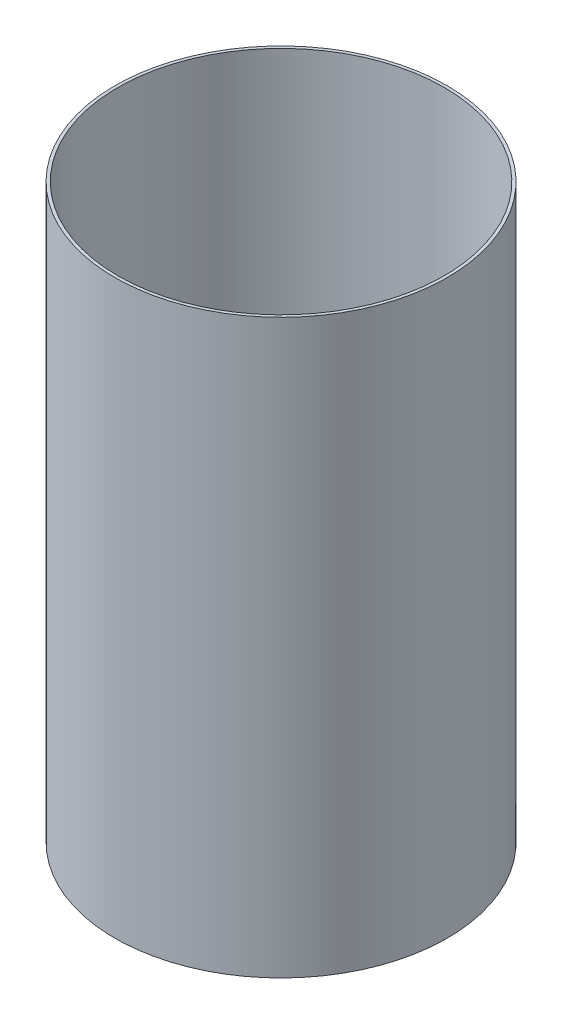
ISO-10303-21;
HEADER;
FILE_DESCRIPTION(('STEP AP214'),'2;1');
FILE_NAME('part.step','',(''),(''),'','','');
FILE_SCHEMA(('AUTOMOTIVE_DESIGN { 1 0 10303 214 1 1 1 1 }'));
ENDSEC;
DATA;
#1=APPLICATION_CONTEXT('core data for automotive mechanical design processes');
#2=APPLICATION_PROTOCOL_DEFINITION('international standard','automotive_design',2000,#1);
#3=PRODUCT_CONTEXT('',#1,'mechanical');
#4=PRODUCT('Part','Part','',(#3));
#5=PRODUCT_RELATED_PRODUCT_CATEGORY('part','',(#4));
#6=PRODUCT_DEFINITION_FORMATION('','',#4);
#7=PRODUCT_DEFINITION_CONTEXT('part definition',#1,'design');
#8=PRODUCT_DEFINITION('design','',#6,#7);
#9=PRODUCT_DEFINITION_SHAPE('','',#8);
#10=(LENGTH_UNIT() NAMED_UNIT(*) SI_UNIT(.MILLI.,.METRE.));
#11=(NAMED_UNIT(*) PLANE_ANGLE_UNIT() SI_UNIT($,.RADIAN.));
#12=(NAMED_UNIT(*) SI_UNIT($,.STERADIAN.) SOLID_ANGLE_UNIT());
#13=UNCERTAINTY_MEASURE_WITH_UNIT(LENGTH_MEASURE(1.E-05),#10,'distance_accuracy_value','');
#14=(GEOMETRIC_REPRESENTATION_CONTEXT(3) GLOBAL_UNCERTAINTY_ASSIGNED_CONTEXT((#13)) GLOBAL_UNIT_ASSIGNED_CONTEXT((#10,
#11,#12)) REPRESENTATION_CONTEXT('',''));
#15=CARTESIAN_POINT('',(0.,0.,0.));
#16=DIRECTION('',(0.,0.,1.));
#17=DIRECTION('',(1.,0.,0.));
#18=AXIS2_PLACEMENT_3D('',#15,#16,#17);
#19=CARTESIAN_POINT('',(0.,304.8,0.));
#20=DIRECTION('',(0.,1.,0.));
#21=DIRECTION('',(0.,0.,1.));
#22=AXIS2_PLACEMENT_3D('',#19,#20,#21);
#23=PLANE('',#22);
#24=CARTESIAN_POINT('',(0.,304.8,0.));
#25=DIRECTION('',(0.,1.,0.));
#26=DIRECTION('',(0.,0.,1.));
#27=AXIS2_PLACEMENT_3D('',#24,#25,#26);
#28=CIRCLE('',#27,88.519);
#29=CARTESIAN_POINT('',(0.,304.8,-88.519));
#30=VERTEX_POINT('',#29);
#31=EDGE_CURVE('E10',#30,#30,#28,.T.);
#32=ORIENTED_EDGE('',*,*,#31,.T.);
#33=EDGE_LOOP('',(#32));
#34=FACE_BOUND('',#33,.T.);
#35=CARTESIAN_POINT('',(0.,304.8,0.));
#36=DIRECTION('',(0.,1.,0.));
#37=DIRECTION('',(0.,0.,1.));
#38=AXIS2_PLACEMENT_3D('',#35,#36,#37);
#39=CIRCLE('',#38,86.9315);
#40=CARTESIAN_POINT('',(0.,304.8,-86.9315));
#41=VERTEX_POINT('',#40);
#42=EDGE_CURVE('E56',#41,#41,#39,.T.);
#43=ORIENTED_EDGE('',*,*,#42,.F.);
#44=EDGE_LOOP('',(#43));
#45=FACE_BOUND('',#44,.T.);
#46=ADVANCED_FACE('F43',(#34,#45),#23,.T.);
#47=CARTESIAN_POINT('',(0.,0.,0.));
#48=DIRECTION('',(0.,1.,0.));
#49=DIRECTION('',(0.,0.,1.));
#50=AXIS2_PLACEMENT_3D('',#47,#48,#49);
#51=PLANE('',#50);
#52=CARTESIAN_POINT('',(0.,0.,0.));
#53=DIRECTION('',(0.,1.,0.));
#54=DIRECTION('',(0.,0.,1.));
#55=AXIS2_PLACEMENT_3D('',#52,#53,#54);
#56=CIRCLE('',#55,88.519);
#57=CARTESIAN_POINT('',(0.,0.,-88.519));
#58=VERTEX_POINT('',#57);
#59=EDGE_CURVE('E47',#58,#58,#56,.T.);
#60=ORIENTED_EDGE('',*,*,#59,.F.);
#61=EDGE_LOOP('',(#60));
#62=FACE_BOUND('',#61,.T.);
#63=CARTESIAN_POINT('',(0.,0.,0.));
#64=DIRECTION('',(0.,1.,0.));
#65=DIRECTION('',(0.,0.,1.));
#66=AXIS2_PLACEMENT_3D('',#63,#64,#65);
#67=CIRCLE('',#66,86.9315);
#68=CARTESIAN_POINT('',(0.,0.,-86.9315));
#69=VERTEX_POINT('',#68);
#70=EDGE_CURVE('E58',#69,#69,#67,.T.);
#71=ORIENTED_EDGE('',*,*,#70,.T.);
#72=EDGE_LOOP('',(#71));
#73=FACE_BOUND('',#72,.T.);
#74=ADVANCED_FACE('F70',(#62,#73),#51,.F.);
#75=CARTESIAN_POINT('',(0.,304.8,0.));
#76=DIRECTION('',(0.,-1.,0.));
#77=DIRECTION('',(0.,0.,-1.));
#78=AXIS2_PLACEMENT_3D('',#75,#76,#77);
#79=CYLINDRICAL_SURFACE('',#78,88.519);
#80=CARTESIAN_POINT('',(0.,304.8,-88.519));
#81=CARTESIAN_POINT('',(0.,301.625,-88.519));
#82=CARTESIAN_POINT('',(0.,298.45,-88.519));
#83=CARTESIAN_POINT('',(0.,292.1,-88.519));
#84=CARTESIAN_POINT('',(0.,288.925,-88.519));
#85=CARTESIAN_POINT('',(0.,282.575,-88.519));
#86=CARTESIAN_POINT('',(0.,279.4,-88.519));
#87=CARTESIAN_POINT('',(0.,273.05,-88.519));
#88=CARTESIAN_POINT('',(0.,269.875,-88.519));
#89=CARTESIAN_POINT('',(0.,263.525,-88.519));
#90=CARTESIAN_POINT('',(0.,260.35,-88.519));
#91=CARTESIAN_POINT('',(0.,254.,-88.519));
#92=CARTESIAN_POINT('',(0.,250.825,-88.519));
#93=CARTESIAN_POINT('',(0.,244.475,-88.519));
#94=CARTESIAN_POINT('',(0.,241.3,-88.519));
#95=CARTESIAN_POINT('',(0.,234.95,-88.519));
#96=CARTESIAN_POINT('',(0.,231.775,-88.519));
#97=CARTESIAN_POINT('',(0.,225.425,-88.519));
#98=CARTESIAN_POINT('',(0.,222.25,-88.519));
#99=CARTESIAN_POINT('',(0.,215.9,-88.519));
#100=CARTESIAN_POINT('',(0.,212.725,-88.519));
#101=CARTESIAN_POINT('',(0.,206.375,-88.519));
#102=CARTESIAN_POINT('',(0.,203.2,-88.519));
#103=CARTESIAN_POINT('',(0.,196.85,-88.519));
#104=CARTESIAN_POINT('',(0.,193.675,-88.519));
#105=CARTESIAN_POINT('',(0.,187.325,-88.519));
#106=CARTESIAN_POINT('',(0.,184.15,-88.519));
#107=CARTESIAN_POINT('',(0.,177.8,-88.519));
#108=CARTESIAN_POINT('',(0.,174.625,-88.519));
#109=CARTESIAN_POINT('',(0.,168.275,-88.519));
#110=CARTESIAN_POINT('',(0.,165.1,-88.519));
#111=CARTESIAN_POINT('',(0.,158.75,-88.519));
#112=CARTESIAN_POINT('',(0.,155.575,-88.519));
#113=CARTESIAN_POINT('',(0.,149.225,-88.519));
#114=CARTESIAN_POINT('',(0.,146.05,-88.519));
#115=CARTESIAN_POINT('',(0.,139.7,-88.519));
#116=CARTESIAN_POINT('',(0.,136.525,-88.519));
#117=CARTESIAN_POINT('',(0.,130.175,-88.519));
#118=CARTESIAN_POINT('',(0.,127.,-88.519));
#119=CARTESIAN_POINT('',(0.,120.65,-88.519));
#120=CARTESIAN_POINT('',(0.,117.475,-88.519));
#121=CARTESIAN_POINT('',(0.,111.125,-88.519));
#122=CARTESIAN_POINT('',(0.,107.95,-88.519));
#123=CARTESIAN_POINT('',(0.,101.6,-88.519));
#124=CARTESIAN_POINT('',(0.,98.425,-88.519));
#125=CARTESIAN_POINT('',(0.,92.075,-88.519));
#126=CARTESIAN_POINT('',(0.,88.9,-88.519));
#127=CARTESIAN_POINT('',(0.,82.55,-88.519));
#128=CARTESIAN_POINT('',(0.,79.375,-88.519));
#129=CARTESIAN_POINT('',(0.,73.025,-88.519));
#130=CARTESIAN_POINT('',(0.,69.85,-88.519));
#131=CARTESIAN_POINT('',(0.,63.5,-88.519));
#132=CARTESIAN_POINT('',(0.,60.325,-88.519));
#133=CARTESIAN_POINT('',(0.,53.975,-88.519));
#134=CARTESIAN_POINT('',(0.,50.8,-88.519));
#135=CARTESIAN_POINT('',(0.,44.45,-88.519));
#136=CARTESIAN_POINT('',(0.,41.275,-88.519));
#137=CARTESIAN_POINT('',(0.,34.925,-88.519));
#138=CARTESIAN_POINT('',(0.,31.75,-88.519));
#139=CARTESIAN_POINT('',(0.,25.4,-88.519));
#140=CARTESIAN_POINT('',(0.,22.225,-88.519));
#141=CARTESIAN_POINT('',(0.,15.875,-88.519));
#142=CARTESIAN_POINT('',(0.,12.7,-88.519));
#143=CARTESIAN_POINT('',(0.,6.35,-88.519));
#144=CARTESIAN_POINT('',(0.,3.175,-88.519));
#145=CARTESIAN_POINT('',(0.,0.,-88.519));
#146=B_SPLINE_CURVE_WITH_KNOTS('',3,(#80,#81,#82,#83,#84,#85,#86,#87,#88,#89,#90,#91,#92,#93,
#94,#95,#96,#97,#98,#99,#100,#101,#102,#103,#104,#105,#106,#107,#108,#109,#110,#111,#112,#113,
#114,#115,#116,#117,#118,#119,#120,#121,#122,#123,#124,#125,#126,#127,#128,#129,#130,#131,#132,
#133,#134,#135,#136,#137,#138,#139,#140,#141,#142,#143,#144,#145),.UNSPECIFIED.,.F.,.F.,(4,2,2,
2,2,2,2,2,2,2,2,2,2,2,2,2,2,2,2,2,2,2,2,2,2,2,2,2,2,2,2,2,4),(0.,9.52500000000001,19.05,28.575,
38.1,47.625,57.15,66.675,76.2,85.7250000000001,95.2500000000001,104.775,114.3,123.825,133.35,
142.875,152.4,161.925,171.45,180.975,190.5,200.025,209.55,219.075,228.6,238.125,247.65,257.175,
266.7,276.225,285.75,295.275,304.8),.UNSPECIFIED.);
#147=EDGE_CURVE('BSEAM45',#30,#58,#146,.T.);
#148=ORIENTED_EDGE('',*,*,#31,.F.);
#149=ORIENTED_EDGE('',*,*,#59,.T.);
#150=ORIENTED_EDGE('',*,*,#147,.T.);
#151=ORIENTED_EDGE('',*,*,#147,.F.);
#152=EDGE_LOOP('',(#148,#150,#149,#151));
#153=FACE_BOUND('',#152,.T.);
#154=ADVANCED_FACE('F45',(#153),#79,.T.);
#155=CARTESIAN_POINT('',(0.,304.8,0.));
#156=DIRECTION('',(0.,-1.,0.));
#157=DIRECTION('',(0.,0.,-1.));
#158=AXIS2_PLACEMENT_3D('',#155,#156,#157);
#159=CYLINDRICAL_SURFACE('',#158,86.9315);
#160=CARTESIAN_POINT('',(0.,304.8,-86.9315));
#161=CARTESIAN_POINT('',(0.,301.625,-86.9315));
#162=CARTESIAN_POINT('',(0.,298.45,-86.9315));
#163=CARTESIAN_POINT('',(0.,292.1,-86.9315));
#164=CARTESIAN_POINT('',(0.,288.925,-86.9315));
#165=CARTESIAN_POINT('',(0.,282.575,-86.9315));
#166=CARTESIAN_POINT('',(0.,279.4,-86.9315));
#167=CARTESIAN_POINT('',(0.,273.05,-86.9315));
#168=CARTESIAN_POINT('',(0.,269.875,-86.9315));
#169=CARTESIAN_POINT('',(0.,263.525,-86.9315));
#170=CARTESIAN_POINT('',(0.,260.35,-86.9315));
#171=CARTESIAN_POINT('',(0.,254.,-86.9315));
#172=CARTESIAN_POINT('',(0.,250.825,-86.9315));
#173=CARTESIAN_POINT('',(0.,244.475,-86.9315));
#174=CARTESIAN_POINT('',(0.,241.3,-86.9315));
#175=CARTESIAN_POINT('',(0.,234.95,-86.9315));
#176=CARTESIAN_POINT('',(0.,231.775,-86.9315));
#177=CARTESIAN_POINT('',(0.,225.425,-86.9315));
#178=CARTESIAN_POINT('',(0.,222.25,-86.9315));
#179=CARTESIAN_POINT('',(0.,215.9,-86.9315));
#180=CARTESIAN_POINT('',(0.,212.725,-86.9315));
#181=CARTESIAN_POINT('',(0.,206.375,-86.9315));
#182=CARTESIAN_POINT('',(0.,203.2,-86.9315));
#183=CARTESIAN_POINT('',(0.,196.85,-86.9315));
#184=CARTESIAN_POINT('',(0.,193.675,-86.9315));
#185=CARTESIAN_POINT('',(0.,187.325,-86.9315));
#186=CARTESIAN_POINT('',(0.,184.15,-86.9315));
#187=CARTESIAN_POINT('',(0.,177.8,-86.9315));
#188=CARTESIAN_POINT('',(0.,174.625,-86.9315));
#189=CARTESIAN_POINT('',(0.,168.275,-86.9315));
#190=CARTESIAN_POINT('',(0.,165.1,-86.9315));
#191=CARTESIAN_POINT('',(0.,158.75,-86.9315));
#192=CARTESIAN_POINT('',(0.,155.575,-86.9315));
#193=CARTESIAN_POINT('',(0.,149.225,-86.9315));
#194=CARTESIAN_POINT('',(0.,146.05,-86.9315));
#195=CARTESIAN_POINT('',(0.,139.7,-86.9315));
#196=CARTESIAN_POINT('',(0.,136.525,-86.9315));
#197=CARTESIAN_POINT('',(0.,130.175,-86.9315));
#198=CARTESIAN_POINT('',(0.,127.,-86.9315));
#199=CARTESIAN_POINT('',(0.,120.65,-86.9315));
#200=CARTESIAN_POINT('',(0.,117.475,-86.9315));
#201=CARTESIAN_POINT('',(0.,111.125,-86.9315));
#202=CARTESIAN_POINT('',(0.,107.95,-86.9315));
#203=CARTESIAN_POINT('',(0.,101.6,-86.9315));
#204=CARTESIAN_POINT('',(0.,98.425,-86.9315));
#205=CARTESIAN_POINT('',(0.,92.075,-86.9315));
#206=CARTESIAN_POINT('',(0.,88.9,-86.9315));
#207=CARTESIAN_POINT('',(0.,82.55,-86.9315));
#208=CARTESIAN_POINT('',(0.,79.375,-86.9315));
#209=CARTESIAN_POINT('',(0.,73.025,-86.9315));
#210=CARTESIAN_POINT('',(0.,69.85,-86.9315));
#211=CARTESIAN_POINT('',(0.,63.5,-86.9315));
#212=CARTESIAN_POINT('',(0.,60.325,-86.9315));
#213=CARTESIAN_POINT('',(0.,53.975,-86.9315));
#214=CARTESIAN_POINT('',(0.,50.8,-86.9315));
#215=CARTESIAN_POINT('',(0.,44.45,-86.9315));
#216=CARTESIAN_POINT('',(0.,41.275,-86.9315));
#217=CARTESIAN_POINT('',(0.,34.925,-86.9315));
#218=CARTESIAN_POINT('',(0.,31.75,-86.9315));
#219=CARTESIAN_POINT('',(0.,25.4,-86.9315));
#220=CARTESIAN_POINT('',(0.,22.225,-86.9315));
#221=CARTESIAN_POINT('',(0.,15.875,-86.9315));
#222=CARTESIAN_POINT('',(0.,12.7,-86.9315));
#223=CARTESIAN_POINT('',(0.,6.35,-86.9315));
#224=CARTESIAN_POINT('',(0.,3.175,-86.9315));
#225=CARTESIAN_POINT('',(0.,0.,-86.9315));
#226=B_SPLINE_CURVE_WITH_KNOTS('',3,(#160,#161,#162,#163,#164,#165,#166,#167,#168,#169,#170,
#171,#172,#173,#174,#175,#176,#177,#178,#179,#180,#181,#182,#183,#184,#185,#186,#187,#188,#189,
#190,#191,#192,#193,#194,#195,#196,#197,#198,#199,#200,#201,#202,#203,#204,#205,#206,#207,#208,
#209,#210,#211,#212,#213,#214,#215,#216,#217,#218,#219,#220,#221,#222,#223,#224,#225),
.UNSPECIFIED.,.F.,.F.,(4,2,2,2,2,2,2,2,2,2,2,2,2,2,2,2,2,2,2,2,2,2,2,2,2,2,2,2,2,2,2,2,4),(0.,
9.52499999999995,19.05,28.575,38.1,47.625,57.15,66.675,76.2,85.725,95.2499999999999,104.775,
114.3,123.825,133.35,142.875,152.4,161.925,171.45,180.975,190.5,200.025,209.55,219.075,228.6,
238.125,247.65,257.175,266.7,276.225,285.75,295.275,304.8),.UNSPECIFIED.);
#227=EDGE_CURVE('BSEAM66',#41,#69,#226,.T.);
#228=ORIENTED_EDGE('',*,*,#42,.T.);
#229=ORIENTED_EDGE('',*,*,#70,.F.);
#230=ORIENTED_EDGE('',*,*,#227,.T.);
#231=ORIENTED_EDGE('',*,*,#227,.F.);
#232=EDGE_LOOP('',(#228,#230,#229,#231));
#233=FACE_BOUND('',#232,.T.);
#234=ADVANCED_FACE('F66',(#233),#159,.F.);
#235=CLOSED_SHELL('',(#46,#74,#154,#234));
#236=MANIFOLD_SOLID_BREP('B2',#235);
#237=ADVANCED_BREP_SHAPE_REPRESENTATION('',(#18,#236),#14);
#238=SHAPE_DEFINITION_REPRESENTATION(#9,#237);
ENDSEC;
END-ISO-10303-21;
